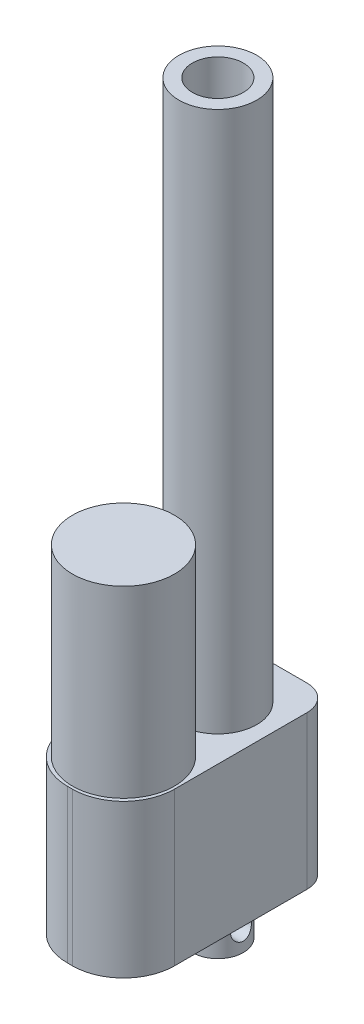
ISO-10303-21;
HEADER;
FILE_DESCRIPTION(('STEP AP214'),'2;1');
FILE_NAME('part.step','',(''),(''),'','','');
FILE_SCHEMA(('AUTOMOTIVE_DESIGN { 1 0 10303 214 1 1 1 1 }'));
ENDSEC;
DATA;
#1=APPLICATION_CONTEXT('core data for automotive mechanical design processes');
#2=APPLICATION_PROTOCOL_DEFINITION('international standard','automotive_design',2000,#1);
#3=PRODUCT_CONTEXT('',#1,'mechanical');
#4=PRODUCT('Part','Part','',(#3));
#5=PRODUCT_RELATED_PRODUCT_CATEGORY('part','',(#4));
#6=PRODUCT_DEFINITION_FORMATION('','',#4);
#7=PRODUCT_DEFINITION_CONTEXT('part definition',#1,'design');
#8=PRODUCT_DEFINITION('design','',#6,#7);
#9=PRODUCT_DEFINITION_SHAPE('','',#8);
#10=(LENGTH_UNIT() NAMED_UNIT(*) SI_UNIT(.MILLI.,.METRE.));
#11=(NAMED_UNIT(*) PLANE_ANGLE_UNIT() SI_UNIT($,.RADIAN.));
#12=(NAMED_UNIT(*) SI_UNIT($,.STERADIAN.) SOLID_ANGLE_UNIT());
#13=UNCERTAINTY_MEASURE_WITH_UNIT(LENGTH_MEASURE(1.E-05),#10,'distance_accuracy_value','');
#14=(GEOMETRIC_REPRESENTATION_CONTEXT(3) GLOBAL_UNCERTAINTY_ASSIGNED_CONTEXT((#13)) GLOBAL_UNIT_ASSIGNED_CONTEXT((#10,
#11,#12)) REPRESENTATION_CONTEXT('',''));
#15=CARTESIAN_POINT('',(0.,0.,0.));
#16=DIRECTION('',(0.,0.,1.));
#17=DIRECTION('',(1.,0.,0.));
#18=AXIS2_PLACEMENT_3D('',#15,#16,#17);
#19=CARTESIAN_POINT('',(-1.,-60.,38.));
#20=DIRECTION('',(0.,-1.,0.));
#21=DIRECTION('',(0.,0.,-1.));
#22=AXIS2_PLACEMENT_3D('',#19,#20,#21);
#23=PLANE('',#22);
#24=DIRECTION('',(1.,0.,0.));
#25=VECTOR('',#24,1.);
#26=CARTESIAN_POINT('',(-21.,-60.,-24.));
#27=LINE('',#26,#25);
#28=CARTESIAN_POINT('',(-11.,-60.,-24.));
#29=VERTEX_POINT('',#28);
#30=CARTESIAN_POINT('',(11.,-60.,-24.));
#31=VERTEX_POINT('',#30);
#32=EDGE_CURVE('E239',#29,#31,#27,.T.);
#33=ORIENTED_EDGE('',*,*,#32,.T.);
#34=CARTESIAN_POINT('',(11.,-60.,-14.));
#35=DIRECTION('',(0.,-1.,0.));
#36=DIRECTION('',(0.,0.,-1.));
#37=AXIS2_PLACEMENT_3D('',#34,#35,#36);
#38=CIRCLE('',#37,10.);
#39=CARTESIAN_POINT('',(21.,-60.,-14.));
#40=VERTEX_POINT('',#39);
#41=EDGE_CURVE('E39',#31,#40,#38,.T.);
#42=ORIENTED_EDGE('',*,*,#41,.T.);
#43=DIRECTION('',(0.,0.,1.));
#44=VECTOR('',#43,1.);
#45=CARTESIAN_POINT('',(21.,-60.,37.9999999999999));
#46=LINE('',#45,#44);
#47=CARTESIAN_POINT('',(21.,-60.,37.9999999999999));
#48=VERTEX_POINT('',#47);
#49=EDGE_CURVE('E97',#40,#48,#46,.T.);
#50=ORIENTED_EDGE('',*,*,#49,.T.);
#51=CARTESIAN_POINT('',(0.999999999999997,-60.,38.));
#52=DIRECTION('',(0.,-1.,0.));
#53=DIRECTION('',(0.,0.,-1.));
#54=AXIS2_PLACEMENT_3D('',#51,#52,#53);
#55=CIRCLE('',#54,20.);
#56=CARTESIAN_POINT('',(0.999999999999852,-60.,58.));
#57=VERTEX_POINT('',#56);
#58=EDGE_CURVE('E100',#48,#57,#55,.T.);
#59=ORIENTED_EDGE('',*,*,#58,.T.);
#60=DIRECTION('',(-1.,0.,0.));
#61=VECTOR('',#60,1.);
#62=CARTESIAN_POINT('',(-0.999999999999862,-60.,58.));
#63=LINE('',#62,#61);
#64=CARTESIAN_POINT('',(-0.99999999999986,-60.,58.));
#65=VERTEX_POINT('',#64);
#66=EDGE_CURVE('E116',#57,#65,#63,.T.);
#67=ORIENTED_EDGE('',*,*,#66,.T.);
#68=CARTESIAN_POINT('',(-1.,-60.,38.));
#69=DIRECTION('',(0.,-1.,0.));
#70=DIRECTION('',(0.,0.,-1.));
#71=AXIS2_PLACEMENT_3D('',#68,#69,#70);
#72=CIRCLE('',#71,20.);
#73=CARTESIAN_POINT('',(-21.,-60.,37.9999999999999));
#74=VERTEX_POINT('',#73);
#75=EDGE_CURVE('E255',#65,#74,#72,.T.);
#76=ORIENTED_EDGE('',*,*,#75,.T.);
#77=DIRECTION('',(0.,0.,-1.));
#78=VECTOR('',#77,1.);
#79=CARTESIAN_POINT('',(-21.,-60.,37.9999999999999));
#80=LINE('',#79,#78);
#81=CARTESIAN_POINT('',(-21.,-60.,-14.));
#82=VERTEX_POINT('',#81);
#83=EDGE_CURVE('E259',#74,#82,#80,.T.);
#84=ORIENTED_EDGE('',*,*,#83,.T.);
#85=CARTESIAN_POINT('',(-11.,-60.,-14.));
#86=DIRECTION('',(0.,-1.,0.));
#87=DIRECTION('',(0.,0.,-1.));
#88=AXIS2_PLACEMENT_3D('',#85,#86,#87);
#89=CIRCLE('',#88,10.);
#90=EDGE_CURVE('E216',#82,#29,#89,.T.);
#91=ORIENTED_EDGE('',*,*,#90,.T.);
#92=EDGE_LOOP('',(#33,#42,#50,#59,#67,#76,#84,#91));
#93=FACE_BOUND('',#92,.T.);
#94=CARTESIAN_POINT('',(0.,-60.,0.));
#95=DIRECTION('',(0.,-1.,0.));
#96=DIRECTION('',(0.,0.,-1.));
#97=AXIS2_PLACEMENT_3D('',#94,#95,#96);
#98=CIRCLE('',#97,10.);
#99=CARTESIAN_POINT('',(0.,-60.,-10.));
#100=VERTEX_POINT('',#99);
#101=EDGE_CURVE('E263',#100,#100,#98,.T.);
#102=ORIENTED_EDGE('',*,*,#101,.F.);
#103=EDGE_LOOP('',(#102));
#104=FACE_BOUND('',#103,.T.);
#105=ADVANCED_FACE('F31',(#93,#104),#23,.T.);
#106=CARTESIAN_POINT('',(-1.,0.,38.));
#107=DIRECTION('',(0.,-1.,0.));
#108=DIRECTION('',(0.,0.,-1.));
#109=AXIS2_PLACEMENT_3D('',#106,#107,#108);
#110=PLANE('',#109);
#111=CARTESIAN_POINT('',(0.,0.,0.));
#112=DIRECTION('',(0.,-1.,0.));
#113=DIRECTION('',(0.,0.,-1.));
#114=AXIS2_PLACEMENT_3D('',#111,#112,#113);
#115=CIRCLE('',#114,15.25);
#116=CARTESIAN_POINT('',(0.,0.,-15.25));
#117=VERTEX_POINT('',#116);
#118=EDGE_CURVE('E122',#117,#117,#115,.T.);
#119=ORIENTED_EDGE('',*,*,#118,.T.);
#120=EDGE_LOOP('',(#119));
#121=FACE_BOUND('',#120,.T.);
#122=DIRECTION('',(0.,0.,1.));
#123=VECTOR('',#122,1.);
#124=CARTESIAN_POINT('',(21.,0.,37.9999999999999));
#125=LINE('',#124,#123);
#126=CARTESIAN_POINT('',(21.,0.,-14.));
#127=VERTEX_POINT('',#126);
#128=CARTESIAN_POINT('',(21.,0.,37.9999999999999));
#129=VERTEX_POINT('',#128);
#130=EDGE_CURVE('E120',#127,#129,#125,.T.);
#131=ORIENTED_EDGE('',*,*,#130,.F.);
#132=CARTESIAN_POINT('',(11.,0.,-14.));
#133=DIRECTION('',(0.,-1.,0.));
#134=DIRECTION('',(0.,0.,-1.));
#135=AXIS2_PLACEMENT_3D('',#132,#133,#134);
#136=CIRCLE('',#135,10.);
#137=CARTESIAN_POINT('',(11.,0.,-24.));
#138=VERTEX_POINT('',#137);
#139=EDGE_CURVE('E223',#127,#138,#136,.F.);
#140=ORIENTED_EDGE('',*,*,#139,.T.);
#141=DIRECTION('',(1.,0.,0.));
#142=VECTOR('',#141,1.);
#143=CARTESIAN_POINT('',(-21.,0.,-24.));
#144=LINE('',#143,#142);
#145=CARTESIAN_POINT('',(-11.,0.,-24.));
#146=VERTEX_POINT('',#145);
#147=EDGE_CURVE('E107',#146,#138,#144,.T.);
#148=ORIENTED_EDGE('',*,*,#147,.F.);
#149=CARTESIAN_POINT('',(-11.,0.,-14.));
#150=DIRECTION('',(0.,-1.,0.));
#151=DIRECTION('',(0.,0.,-1.));
#152=AXIS2_PLACEMENT_3D('',#149,#150,#151);
#153=CIRCLE('',#152,10.);
#154=CARTESIAN_POINT('',(-21.,0.,-14.));
#155=VERTEX_POINT('',#154);
#156=EDGE_CURVE('E225',#146,#155,#153,.F.);
#157=ORIENTED_EDGE('',*,*,#156,.T.);
#158=DIRECTION('',(0.,0.,-1.));
#159=VECTOR('',#158,1.);
#160=CARTESIAN_POINT('',(-21.,0.,37.9999999999999));
#161=LINE('',#160,#159);
#162=CARTESIAN_POINT('',(-21.,0.,37.9999999999999));
#163=VERTEX_POINT('',#162);
#164=EDGE_CURVE('E245',#163,#155,#161,.T.);
#165=ORIENTED_EDGE('',*,*,#164,.F.);
#166=CARTESIAN_POINT('',(-1.,0.,38.));
#167=DIRECTION('',(0.,-1.,0.));
#168=DIRECTION('',(0.,0.,-1.));
#169=AXIS2_PLACEMENT_3D('',#166,#167,#168);
#170=CIRCLE('',#169,20.);
#171=CARTESIAN_POINT('',(-0.99999999999986,0.,58.));
#172=VERTEX_POINT('',#171);
#173=EDGE_CURVE('E243',#172,#163,#170,.T.);
#174=ORIENTED_EDGE('',*,*,#173,.F.);
#175=DIRECTION('',(-1.,0.,0.));
#176=VECTOR('',#175,1.);
#177=CARTESIAN_POINT('',(-0.999999999999862,0.,58.));
#178=LINE('',#177,#176);
#179=CARTESIAN_POINT('',(0.999999999999852,0.,58.));
#180=VERTEX_POINT('',#179);
#181=EDGE_CURVE('E233',#180,#172,#178,.T.);
#182=ORIENTED_EDGE('',*,*,#181,.F.);
#183=CARTESIAN_POINT('',(0.999999999999997,0.,38.));
#184=DIRECTION('',(0.,-1.,0.));
#185=DIRECTION('',(0.,0.,-1.));
#186=AXIS2_PLACEMENT_3D('',#183,#184,#185);
#187=CIRCLE('',#186,20.);
#188=EDGE_CURVE('E230',#129,#180,#187,.T.);
#189=ORIENTED_EDGE('',*,*,#188,.F.);
#190=EDGE_LOOP('',(#131,#140,#148,#157,#165,#174,#182,#189));
#191=FACE_BOUND('',#190,.T.);
#192=CARTESIAN_POINT('',(0.,0.,37.));
#193=DIRECTION('',(0.,-1.,0.));
#194=DIRECTION('',(0.,0.,-1.));
#195=AXIS2_PLACEMENT_3D('',#192,#193,#194);
#196=CIRCLE('',#195,20.);
#197=CARTESIAN_POINT('',(0.,0.,17.));
#198=VERTEX_POINT('',#197);
#199=EDGE_CURVE('E133',#198,#198,#196,.F.);
#200=ORIENTED_EDGE('',*,*,#199,.F.);
#201=EDGE_LOOP('',(#200));
#202=FACE_BOUND('',#201,.T.);
#203=ADVANCED_FACE('F171',(#121,#191,#202),#110,.F.);
#204=CARTESIAN_POINT('',(0.,212.,0.));
#205=DIRECTION('',(0.,-1.,0.));
#206=DIRECTION('',(0.,0.,-1.));
#207=AXIS2_PLACEMENT_3D('',#204,#205,#206);
#208=CYLINDRICAL_SURFACE('',#207,15.25);
#209=CARTESIAN_POINT('',(0.,212.,0.));
#210=DIRECTION('',(0.,1.,0.));
#211=DIRECTION('',(0.,0.,1.));
#212=AXIS2_PLACEMENT_3D('',#209,#210,#211);
#213=CIRCLE('',#212,15.25);
#214=CARTESIAN_POINT('',(0.,212.,15.25));
#215=VERTEX_POINT('',#214);
#216=EDGE_CURVE('E125',#215,#215,#213,.T.);
#217=ORIENTED_EDGE('',*,*,#216,.F.);
#218=EDGE_LOOP('',(#217));
#219=FACE_BOUND('',#218,.T.);
#220=ORIENTED_EDGE('',*,*,#118,.F.);
#221=EDGE_LOOP('',(#220));
#222=FACE_BOUND('',#221,.T.);
#223=ADVANCED_FACE('F176',(#219,#222),#208,.T.);
#224=CARTESIAN_POINT('',(0.,212.,0.));
#225=DIRECTION('',(0.,1.,0.));
#226=DIRECTION('',(0.,0.,1.));
#227=AXIS2_PLACEMENT_3D('',#224,#225,#226);
#228=PLANE('',#227);
#229=CARTESIAN_POINT('',(0.,212.,0.));
#230=DIRECTION('',(0.,1.,0.));
#231=DIRECTION('',(0.,0.,1.));
#232=AXIS2_PLACEMENT_3D('',#229,#230,#231);
#233=CIRCLE('',#232,10.);
#234=CARTESIAN_POINT('',(0.,212.,10.));
#235=VERTEX_POINT('',#234);
#236=EDGE_CURVE('E267',#235,#235,#233,.T.);
#237=ORIENTED_EDGE('',*,*,#236,.F.);
#238=EDGE_LOOP('',(#237));
#239=FACE_BOUND('',#238,.T.);
#240=ORIENTED_EDGE('',*,*,#216,.T.);
#241=EDGE_LOOP('',(#240));
#242=FACE_BOUND('',#241,.T.);
#243=ADVANCED_FACE('F200',(#239,#242),#228,.T.);
#244=CARTESIAN_POINT('',(21.,-60.,37.9999999999999));
#245=DIRECTION('',(-1.,0.,0.));
#246=DIRECTION('',(0.,0.,1.));
#247=AXIS2_PLACEMENT_3D('',#244,#245,#246);
#248=PLANE('',#247);
#249=ORIENTED_EDGE('',*,*,#49,.F.);
#250=DIRECTION('',(0.,1.,0.));
#251=VECTOR('',#250,1.);
#252=CARTESIAN_POINT('',(21.,-60.,-14.));
#253=LINE('',#252,#251);
#254=EDGE_CURVE('E136',#40,#127,#253,.T.);
#255=ORIENTED_EDGE('',*,*,#254,.T.);
#256=ORIENTED_EDGE('',*,*,#130,.T.);
#257=DIRECTION('',(0.,1.,0.));
#258=VECTOR('',#257,1.);
#259=CARTESIAN_POINT('',(21.,-60.,37.9999999999999));
#260=LINE('',#259,#258);
#261=EDGE_CURVE('E112',#48,#129,#260,.T.);
#262=ORIENTED_EDGE('',*,*,#261,.F.);
#263=EDGE_LOOP('',(#249,#255,#256,#262));
#264=FACE_BOUND('',#263,.T.);
#265=ADVANCED_FACE('F118',(#264),#248,.F.);
#266=CARTESIAN_POINT('',(0.999999999999997,-60.,38.));
#267=DIRECTION('',(0.,1.,0.));
#268=DIRECTION('',(0.,0.,1.));
#269=AXIS2_PLACEMENT_3D('',#266,#267,#268);
#270=CYLINDRICAL_SURFACE('',#269,20.);
#271=ORIENTED_EDGE('',*,*,#188,.T.);
#272=DIRECTION('',(0.,1.,0.));
#273=VECTOR('',#272,1.);
#274=CARTESIAN_POINT('',(0.999999999999852,-60.,58.));
#275=LINE('',#274,#273);
#276=EDGE_CURVE('E114',#57,#180,#275,.T.);
#277=ORIENTED_EDGE('',*,*,#276,.F.);
#278=ORIENTED_EDGE('',*,*,#58,.F.);
#279=ORIENTED_EDGE('',*,*,#261,.T.);
#280=EDGE_LOOP('',(#271,#277,#278,#279));
#281=FACE_BOUND('',#280,.T.);
#282=ADVANCED_FACE('F111',(#281),#270,.T.);
#283=CARTESIAN_POINT('',(-0.999999999999862,-60.,58.));
#284=DIRECTION('',(0.,0.,-1.));
#285=DIRECTION('',(-1.,0.,0.));
#286=AXIS2_PLACEMENT_3D('',#283,#284,#285);
#287=PLANE('',#286);
#288=ORIENTED_EDGE('',*,*,#181,.T.);
#289=DIRECTION('',(0.,1.,0.));
#290=VECTOR('',#289,1.);
#291=CARTESIAN_POINT('',(-0.99999999999986,-60.,58.));
#292=LINE('',#291,#290);
#293=EDGE_CURVE('E127',#65,#172,#292,.T.);
#294=ORIENTED_EDGE('',*,*,#293,.F.);
#295=ORIENTED_EDGE('',*,*,#66,.F.);
#296=ORIENTED_EDGE('',*,*,#276,.T.);
#297=EDGE_LOOP('',(#288,#294,#295,#296));
#298=FACE_BOUND('',#297,.T.);
#299=ADVANCED_FACE('F191',(#298),#287,.F.);
#300=CARTESIAN_POINT('',(-1.,-60.,38.));
#301=DIRECTION('',(0.,1.,0.));
#302=DIRECTION('',(0.,0.,1.));
#303=AXIS2_PLACEMENT_3D('',#300,#301,#302);
#304=CYLINDRICAL_SURFACE('',#303,20.);
#305=ORIENTED_EDGE('',*,*,#173,.T.);
#306=DIRECTION('',(0.,1.,0.));
#307=VECTOR('',#306,1.);
#308=CARTESIAN_POINT('',(-21.,-60.,37.9999999999999));
#309=LINE('',#308,#307);
#310=EDGE_CURVE('E248',#74,#163,#309,.T.);
#311=ORIENTED_EDGE('',*,*,#310,.F.);
#312=ORIENTED_EDGE('',*,*,#75,.F.);
#313=ORIENTED_EDGE('',*,*,#293,.T.);
#314=EDGE_LOOP('',(#305,#311,#312,#313));
#315=FACE_BOUND('',#314,.T.);
#316=ADVANCED_FACE('F188',(#315),#304,.T.);
#317=CARTESIAN_POINT('',(-21.,-60.,37.9999999999999));
#318=DIRECTION('',(1.,0.,0.));
#319=DIRECTION('',(0.,0.,-1.));
#320=AXIS2_PLACEMENT_3D('',#317,#318,#319);
#321=PLANE('',#320);
#322=ORIENTED_EDGE('',*,*,#164,.T.);
#323=DIRECTION('',(0.,1.,0.));
#324=VECTOR('',#323,1.);
#325=CARTESIAN_POINT('',(-21.,-60.,-14.));
#326=LINE('',#325,#324);
#327=EDGE_CURVE('E11',#155,#82,#326,.F.);
#328=ORIENTED_EDGE('',*,*,#327,.T.);
#329=ORIENTED_EDGE('',*,*,#83,.F.);
#330=ORIENTED_EDGE('',*,*,#310,.T.);
#331=EDGE_LOOP('',(#322,#328,#329,#330));
#332=FACE_BOUND('',#331,.T.);
#333=ADVANCED_FACE('F185',(#332),#321,.F.);
#334=CARTESIAN_POINT('',(-21.,-60.,-24.));
#335=DIRECTION('',(0.,0.,1.));
#336=DIRECTION('',(1.,0.,0.));
#337=AXIS2_PLACEMENT_3D('',#334,#335,#336);
#338=PLANE('',#337);
#339=ORIENTED_EDGE('',*,*,#147,.T.);
#340=DIRECTION('',(0.,1.,0.));
#341=VECTOR('',#340,1.);
#342=CARTESIAN_POINT('',(11.,-60.,-24.));
#343=LINE('',#342,#341);
#344=EDGE_CURVE('E52',#138,#31,#343,.F.);
#345=ORIENTED_EDGE('',*,*,#344,.T.);
#346=ORIENTED_EDGE('',*,*,#32,.F.);
#347=DIRECTION('',(0.,1.,0.));
#348=VECTOR('',#347,1.);
#349=CARTESIAN_POINT('',(-11.,-60.,-24.));
#350=LINE('',#349,#348);
#351=EDGE_CURVE('E220',#29,#146,#350,.T.);
#352=ORIENTED_EDGE('',*,*,#351,.T.);
#353=EDGE_LOOP('',(#339,#345,#346,#352));
#354=FACE_BOUND('',#353,.T.);
#355=ADVANCED_FACE('F182',(#354),#338,.F.);
#356=CARTESIAN_POINT('',(0.,72.,37.));
#357=DIRECTION('',(0.,-1.,0.));
#358=DIRECTION('',(0.,0.,-1.));
#359=AXIS2_PLACEMENT_3D('',#356,#357,#358);
#360=CYLINDRICAL_SURFACE('',#359,20.);
#361=CARTESIAN_POINT('',(0.,72.,37.));
#362=DIRECTION('',(0.,1.,0.));
#363=DIRECTION('',(0.,0.,1.));
#364=AXIS2_PLACEMENT_3D('',#361,#362,#363);
#365=CIRCLE('',#364,20.);
#366=CARTESIAN_POINT('',(0.,72.,57.));
#367=VERTEX_POINT('',#366);
#368=EDGE_CURVE('E231',#367,#367,#365,.T.);
#369=ORIENTED_EDGE('',*,*,#368,.F.);
#370=EDGE_LOOP('',(#369));
#371=FACE_BOUND('',#370,.T.);
#372=ORIENTED_EDGE('',*,*,#199,.T.);
#373=EDGE_LOOP('',(#372));
#374=FACE_BOUND('',#373,.T.);
#375=ADVANCED_FACE('F180',(#371,#374),#360,.T.);
#376=CARTESIAN_POINT('',(0.,72.,37.));
#377=DIRECTION('',(0.,1.,0.));
#378=DIRECTION('',(0.,0.,1.));
#379=AXIS2_PLACEMENT_3D('',#376,#377,#378);
#380=PLANE('',#379);
#381=ORIENTED_EDGE('',*,*,#368,.T.);
#382=EDGE_LOOP('',(#381));
#383=FACE_BOUND('',#382,.T.);
#384=ADVANCED_FACE('F167',(#383),#380,.T.);
#385=CARTESIAN_POINT('',(0.,-80.,0.));
#386=DIRECTION('',(0.,1.,0.));
#387=DIRECTION('',(0.,0.,1.));
#388=AXIS2_PLACEMENT_3D('',#385,#386,#387);
#389=CYLINDRICAL_SURFACE('',#388,10.);
#390=CARTESIAN_POINT('',(-9.12085522305886,-72.,-4.1));
#391=CARTESIAN_POINT('',(-9.12085596533272,-71.8904311101594,-4.09999925967746));
#392=CARTESIAN_POINT('',(-9.12283654243618,-71.7808209192231,-4.09560116971501));
#393=CARTESIAN_POINT('',(-9.13069362544329,-71.5623963121699,-4.07805385179874));
#394=CARTESIAN_POINT('',(-9.13657272649079,-71.4535824749798,-4.06489879454186));
#395=CARTESIAN_POINT('',(-9.15204689017393,-71.237369206976,-4.029938604936));
#396=CARTESIAN_POINT('',(-9.16164997665284,-71.1299733516283,-4.00811479206561));
#397=CARTESIAN_POINT('',(-9.18424889291285,-70.9175908992762,-3.95605463502448));
#398=CARTESIAN_POINT('',(-9.19724614740618,-70.8126053341789,-3.92581475783422));
#399=CARTESIAN_POINT('',(-9.24060853824777,-70.5032519891535,-3.8231810249799));
#400=CARTESIAN_POINT('',(-9.27543059699092,-70.3033749410437,-3.73869002053811));
#401=CARTESIAN_POINT('',(-9.35295862592864,-69.9207960243605,-3.54026011319138));
#402=CARTESIAN_POINT('',(-9.39566255568865,-69.7380897291078,-3.42632882864905));
#403=CARTESIAN_POINT('',(-9.48702803293929,-69.3837870459564,-3.16488096791837));
#404=CARTESIAN_POINT('',(-9.53588754300038,-69.2133415492731,-3.01587054527706));
#405=CARTESIAN_POINT('',(-9.63242754222868,-68.8990185801675,-2.69164176551106));
#406=CARTESIAN_POINT('',(-9.68010757925972,-68.7551511635057,-2.51641353413031));
#407=CARTESIAN_POINT('',(-9.77130889462596,-68.4922470976246,-2.13573178822405));
#408=CARTESIAN_POINT('',(-9.81457332953515,-68.3744983824589,-1.92932159893456));
#409=CARTESIAN_POINT('',(-9.88965682295362,-68.1758918386429,-1.49753033777828));
#410=CARTESIAN_POINT('',(-9.92148080826129,-68.0950181258374,-1.27215748385716));
#411=CARTESIAN_POINT('',(-9.96869581239697,-67.9766066407207,-0.820929418937579));
#412=CARTESIAN_POINT('',(-9.98483657956137,-67.9370838776738,-0.595675159327681));
#413=CARTESIAN_POINT('',(-10.0015844714773,-67.89609137782,-0.14119228472589));
#414=CARTESIAN_POINT('',(-10.0021976864681,-67.8946067216484,0.0880347367606906));
#415=CARTESIAN_POINT('',(-9.9882687994468,-67.9286729210307,0.529557208852952));
#416=CARTESIAN_POINT('',(-9.97461815282765,-67.9620452515331,0.742054067374088));
#417=CARTESIAN_POINT('',(-9.93491042951043,-68.0611553673972,1.15812267080467));
#418=CARTESIAN_POINT('',(-9.90885243989074,-68.1268955343686,1.36169375775963));
#419=CARTESIAN_POINT('',(-9.84636198746041,-68.289668715149,1.75784359059216));
#420=CARTESIAN_POINT('',(-9.80977786154984,-68.3871621657746,1.95020823498028));
#421=CARTESIAN_POINT('',(-9.72983561083603,-68.6102315595739,2.31634838467447));
#422=CARTESIAN_POINT('',(-9.6864751202974,-68.7358173168429,2.4901173621113));
#423=CARTESIAN_POINT('',(-9.59384306988983,-69.021527198417,2.82678641524571));
#424=CARTESIAN_POINT('',(-9.54437006161635,-69.1834287918436,2.98812486066515));
#425=CARTESIAN_POINT('',(-9.44734557070162,-69.5321353234276,3.28202166038336));
#426=CARTESIAN_POINT('',(-9.39979478809316,-69.7189492295125,3.41456960530335));
#427=CARTESIAN_POINT('',(-9.31058773641422,-70.1195072364479,3.65095256972927));
#428=CARTESIAN_POINT('',(-9.2691595423218,-70.3339060351124,3.75377157702678));
#429=CARTESIAN_POINT('',(-9.19958663346997,-70.7791257339871,3.92121471303796));
#430=CARTESIAN_POINT('',(-9.17143277532646,-71.0099352040227,3.98586514009408));
#431=CARTESIAN_POINT('',(-9.13384389631223,-71.4658019823196,4.07123438627854));
#432=CARTESIAN_POINT('',(-9.12333548314578,-71.6902965601388,4.09447809388697));
#433=CARTESIAN_POINT('',(-9.11916269038392,-72.1401757037247,4.10376930250991));
#434=CARTESIAN_POINT('',(-9.12549278427906,-72.365559953251,4.08982900755603));
#435=CARTESIAN_POINT('',(-9.15317769851487,-72.7963183495239,4.02745008704151));
#436=CARTESIAN_POINT('',(-9.17359053249802,-73.0020735427073,3.98117213981194));
#437=CARTESIAN_POINT('',(-9.22595136152163,-73.4027428505744,3.85827032285215));
#438=CARTESIAN_POINT('',(-9.25790199625285,-73.5976544726113,3.78163950841278));
#439=CARTESIAN_POINT('',(-9.33136282255576,-73.9801702746578,3.59665612210532));
#440=CARTESIAN_POINT('',(-9.37321580705946,-74.1671317675103,3.48711504128026));
#441=CARTESIAN_POINT('',(-9.46126413100215,-74.5208992249382,3.24061603577818));
#442=CARTESIAN_POINT('',(-9.50746130179005,-74.6876966207381,3.10364652055162));
#443=CARTESIAN_POINT('',(-9.60336102034687,-75.0099931248203,2.7935233486464));
#444=CARTESIAN_POINT('',(-9.65305467319874,-75.1635835948118,2.61837568113369));
#445=CARTESIAN_POINT('',(-9.74696958396229,-75.4395172814611,2.24362584262218));
#446=CARTESIAN_POINT('',(-9.79119051525483,-75.561858633594,2.04402221347316));
#447=CARTESIAN_POINT('',(-9.8694021992832,-75.7715516218263,1.62491414975622));
#448=CARTESIAN_POINT('',(-9.90337882012906,-75.8588549779099,1.40538276300097));
#449=CARTESIAN_POINT('',(-9.95708468115726,-75.9946799215028,0.953004327918231));
#450=CARTESIAN_POINT('',(-9.97682210086024,-76.0432237756086,0.720165007256111));
#451=CARTESIAN_POINT('',(-9.99891204432231,-76.0974126149518,0.264871065575684));
#452=CARTESIAN_POINT('',(-10.0023560365527,-76.1057516425702,0.042787747061715));
#453=CARTESIAN_POINT('',(-9.99446223101127,-76.0864849765232,-0.39952179902721));
#454=CARTESIAN_POINT('',(-9.9831268816634,-76.0588852366651,-0.619748328125073));
#455=CARTESIAN_POINT('',(-9.94751099059553,-75.9704565860899,-1.04449984233166));
#456=CARTESIAN_POINT('',(-9.92367712380005,-75.9107725683895,-1.24930369986062));
#457=CARTESIAN_POINT('',(-9.86565366173738,-75.7610989719221,-1.64593153731293));
#458=CARTESIAN_POINT('',(-9.83146206802113,-75.671103544411,-1.83775300363132));
#459=CARTESIAN_POINT('',(-9.75414549697255,-75.4588362658745,-2.21243818518471));
#460=CARTESIAN_POINT('',(-9.71068860264697,-75.3352977134736,-2.3945141498123));
#461=CARTESIAN_POINT('',(-9.62002751017241,-75.0613096224511,-2.73612076285873));
#462=CARTESIAN_POINT('',(-9.57282198005288,-74.9108504943616,-2.89564334109287));
#463=CARTESIAN_POINT('',(-9.47611720874012,-74.5756956637151,-3.19845373653412));
#464=CARTESIAN_POINT('',(-9.4266702576376,-74.3894029554774,-3.33999374085981));
#465=CARTESIAN_POINT('',(-9.3343056253387,-73.9939993614421,-3.59007004090854));
#466=CARTESIAN_POINT('',(-9.29139153729628,-73.7848760263176,-3.69858820675982));
#467=CARTESIAN_POINT('',(-9.23622129819828,-73.4591829591169,-3.8333442677463));
#468=CARTESIAN_POINT('',(-9.21940140447578,-73.3489646051561,-3.87351403521268));
#469=CARTESIAN_POINT('',(-9.18931452171964,-73.1250649175959,-3.9443615039296));
#470=CARTESIAN_POINT('',(-9.1760458010338,-73.0113853020365,-3.97504383266126));
#471=CARTESIAN_POINT('',(-9.15358332531828,-72.7817415629849,-4.0264995244157));
#472=CARTESIAN_POINT('',(-9.14437880062055,-72.66578433806,-4.04729908695137));
#473=CARTESIAN_POINT('',(-9.1303524758709,-72.4323063927629,-4.07884371100538));
#474=CARTESIAN_POINT('',(-9.12552723865381,-72.3147869721487,-4.08959665799227));
#475=CARTESIAN_POINT('',(-9.1222741735823,-72.164216339518,-4.09684198073778));
#476=CARTESIAN_POINT('',(-9.12174238638647,-72.1313877221535,-4.09802592436254));
#477=CARTESIAN_POINT('',(-9.1210327987552,-72.0657073078433,-4.0996050473969));
#478=CARTESIAN_POINT('',(-9.12085500047937,-72.0328555107575,-4.10000022199436));
#479=CARTESIAN_POINT('',(-9.12085522305886,-72.,-4.1));
#480=B_SPLINE_CURVE_WITH_KNOTS('',3,(#390,#391,#392,#393,#394,#395,#396,#397,#398,#399,#400,
#401,#402,#403,#404,#405,#406,#407,#408,#409,#410,#411,#412,#413,#414,#415,#416,#417,#418,#419,
#420,#421,#422,#423,#424,#425,#426,#427,#428,#429,#430,#431,#432,#433,#434,#435,#436,#437,#438,
#439,#440,#441,#442,#443,#444,#445,#446,#447,#448,#449,#450,#451,#452,#453,#454,#455,#456,#457,
#458,#459,#460,#461,#462,#463,#464,#465,#466,#467,#468,#469,#470,#471,#472,#473,#474,#475,#476,
#477,#478,#479),.UNSPECIFIED.,.T.,.F.,(4,2,2,2,2,2,2,2,2,2,2,2,2,2,2,2,2,2,2,2,2,2,2,2,2,2,2,2,
2,2,2,2,2,2,2,2,2,2,2,2,2,2,2,2,4),(0.,0.328672117912807,0.657563244052506,0.987166984768422,
1.31690930065161,1.97304413884267,2.62900935650068,3.32078211378878,4.01281606819734,
4.73375144831508,5.45437598660242,6.13855213459813,6.82245992986428,7.46604317889662,
8.10967378955022,8.763087017599,9.4167288741776,10.115178046345,10.813879328211,
11.5342125904293,12.2540489584539,12.928257957815,13.6022457046249,14.2350381243769,
14.8679754101843,15.5272803032894,16.1868643918112,16.8981179872649,17.6094140108089,
18.3216868150722,19.0335501371541,19.6969795678326,20.3602991052417,21.0013834077002,
21.6425914816395,22.3125612243291,22.9827700960302,23.6968784482773,24.4113781606393,
24.7665102641623,25.1214688784181,25.4754811625661,25.8292153527014,25.9277709230013,
26.0263270945705),.UNSPECIFIED.);
#481=CARTESIAN_POINT('',(-9.12085522305886,-72.,-4.1));
#482=VERTEX_POINT('',#481);
#483=EDGE_CURVE('E144',#482,#482,#480,.T.);
#484=ORIENTED_EDGE('',*,*,#483,.T.);
#485=EDGE_LOOP('',(#484));
#486=FACE_BOUND('',#485,.T.);
#487=CARTESIAN_POINT('',(9.12085522305886,-72.,-4.1));
#488=CARTESIAN_POINT('',(9.12085596533272,-72.1095688898405,-4.09999925967746));
#489=CARTESIAN_POINT('',(9.12283654243618,-72.2191790807769,-4.09560116971501));
#490=CARTESIAN_POINT('',(9.1306936254433,-72.4376036878301,-4.07805385179874));
#491=CARTESIAN_POINT('',(9.13657272649079,-72.5464175250202,-4.06489879454186));
#492=CARTESIAN_POINT('',(9.15204689017392,-72.762630793024,-4.029938604936));
#493=CARTESIAN_POINT('',(9.16164997665284,-72.8700266483717,-4.00811479206561));
#494=CARTESIAN_POINT('',(9.18424889291285,-73.0824091007237,-3.95605463502449));
#495=CARTESIAN_POINT('',(9.19724614740618,-73.1873946658211,-3.92581475783422));
#496=CARTESIAN_POINT('',(9.24060853824777,-73.4967480108465,-3.8231810249799));
#497=CARTESIAN_POINT('',(9.27543059699093,-73.6966250589563,-3.73869002053811));
#498=CARTESIAN_POINT('',(9.35295862592864,-74.0792039756395,-3.54026011319138));
#499=CARTESIAN_POINT('',(9.39566255568865,-74.2619102708922,-3.42632882864905));
#500=CARTESIAN_POINT('',(9.48702803293929,-74.6162129540435,-3.16488096791837));
#501=CARTESIAN_POINT('',(9.53588754300038,-74.7866584507269,-3.01587054527706));
#502=CARTESIAN_POINT('',(9.63242754222868,-75.1009814198325,-2.69164176551106));
#503=CARTESIAN_POINT('',(9.68010757925972,-75.2448488364943,-2.51641353413031));
#504=CARTESIAN_POINT('',(9.77130889462596,-75.5077529023754,-2.13573178822405));
#505=CARTESIAN_POINT('',(9.81457332953515,-75.6255016175411,-1.92932159893457));
#506=CARTESIAN_POINT('',(9.88965682295362,-75.8241081613571,-1.49753033777829));
#507=CARTESIAN_POINT('',(9.92148080826129,-75.9049818741626,-1.27215748385716));
#508=CARTESIAN_POINT('',(9.96869581239697,-76.0233933592793,-0.820929418937579));
#509=CARTESIAN_POINT('',(9.98483657956137,-76.0629161223262,-0.595675159327682));
#510=CARTESIAN_POINT('',(10.0015844714773,-76.10390862218,-0.14119228472589));
#511=CARTESIAN_POINT('',(10.0021976864681,-76.1053932783516,0.0880347367606907));
#512=CARTESIAN_POINT('',(9.9882687994468,-76.0713270789693,0.529557208852952));
#513=CARTESIAN_POINT('',(9.97461815282765,-76.0379547484669,0.742054067374088));
#514=CARTESIAN_POINT('',(9.93491042951043,-75.9388446326028,1.15812267080467));
#515=CARTESIAN_POINT('',(9.90885243989074,-75.8731044656314,1.36169375775963));
#516=CARTESIAN_POINT('',(9.84636198746041,-75.710331284851,1.75784359059216));
#517=CARTESIAN_POINT('',(9.80977786154984,-75.6128378342253,1.95020823498028));
#518=CARTESIAN_POINT('',(9.72983561083603,-75.3897684404261,2.31634838467447));
#519=CARTESIAN_POINT('',(9.6864751202974,-75.264182683157,2.4901173621113));
#520=CARTESIAN_POINT('',(9.59384306988983,-74.978472801583,2.82678641524571));
#521=CARTESIAN_POINT('',(9.54437006161635,-74.8165712081563,2.98812486066515));
#522=CARTESIAN_POINT('',(9.44734557070162,-74.4678646765724,3.28202166038336));
#523=CARTESIAN_POINT('',(9.39979478809316,-74.2810507704875,3.41456960530335));
#524=CARTESIAN_POINT('',(9.31058773641422,-73.8804927635521,3.65095256972926));
#525=CARTESIAN_POINT('',(9.26915954232181,-73.6660939648876,3.75377157702677));
#526=CARTESIAN_POINT('',(9.19958663346997,-73.2208742660129,3.92121471303795));
#527=CARTESIAN_POINT('',(9.17143277532647,-72.9900647959773,3.98586514009408));
#528=CARTESIAN_POINT('',(9.13384389631223,-72.5341980176804,4.07123438627854));
#529=CARTESIAN_POINT('',(9.12333548314578,-72.3097034398612,4.09447809388697));
#530=CARTESIAN_POINT('',(9.11916269038392,-71.8598242962753,4.10376930250991));
#531=CARTESIAN_POINT('',(9.12549278427906,-71.634440046749,4.08982900755603));
#532=CARTESIAN_POINT('',(9.15317769851487,-71.2036816504761,4.02745008704151));
#533=CARTESIAN_POINT('',(9.17359053249802,-70.9979264572927,3.98117213981194));
#534=CARTESIAN_POINT('',(9.22595136152163,-70.5972571494256,3.85827032285215));
#535=CARTESIAN_POINT('',(9.25790199625285,-70.4023455273886,3.78163950841278));
#536=CARTESIAN_POINT('',(9.33136282255576,-70.0198297253422,3.59665612210532));
#537=CARTESIAN_POINT('',(9.37321580705946,-69.8328682324897,3.48711504128026));
#538=CARTESIAN_POINT('',(9.46126413100215,-69.4791007750618,3.24061603577818));
#539=CARTESIAN_POINT('',(9.50746130179005,-69.3123033792619,3.10364652055162));
#540=CARTESIAN_POINT('',(9.60336102034687,-68.9900068751796,2.7935233486464));
#541=CARTESIAN_POINT('',(9.65305467319874,-68.8364164051882,2.61837568113369));
#542=CARTESIAN_POINT('',(9.74696958396229,-68.5604827185389,2.24362584262218));
#543=CARTESIAN_POINT('',(9.79119051525483,-68.438141366406,2.04402221347316));
#544=CARTESIAN_POINT('',(9.8694021992832,-68.2284483781737,1.62491414975622));
#545=CARTESIAN_POINT('',(9.90337882012906,-68.1411450220901,1.40538276300097));
#546=CARTESIAN_POINT('',(9.95708468115726,-68.0053200784972,0.953004327918231));
#547=CARTESIAN_POINT('',(9.97682210086024,-67.9567762243914,0.720165007256111));
#548=CARTESIAN_POINT('',(9.99891204432231,-67.9025873850482,0.264871065575684));
#549=CARTESIAN_POINT('',(10.0023560365527,-67.8942483574297,0.042787747061715));
#550=CARTESIAN_POINT('',(9.99446223101127,-67.9135150234768,-0.39952179902721));
#551=CARTESIAN_POINT('',(9.9831268816634,-67.9411147633348,-0.619748328125073));
#552=CARTESIAN_POINT('',(9.94751099059553,-68.0295434139101,-1.04449984233166));
#553=CARTESIAN_POINT('',(9.92367712380005,-68.0892274316104,-1.24930369986062));
#554=CARTESIAN_POINT('',(9.86565366173738,-68.2389010280779,-1.64593153731293));
#555=CARTESIAN_POINT('',(9.83146206802113,-68.328896455589,-1.83775300363132));
#556=CARTESIAN_POINT('',(9.75414549697255,-68.5411637341255,-2.21243818518471));
#557=CARTESIAN_POINT('',(9.71068860264697,-68.6647022865264,-2.3945141498123));
#558=CARTESIAN_POINT('',(9.62002751017241,-68.9386903775489,-2.73612076285873));
#559=CARTESIAN_POINT('',(9.57282198005288,-69.0891495056384,-2.89564334109287));
#560=CARTESIAN_POINT('',(9.47611720874012,-69.4243043362849,-3.19845373653412));
#561=CARTESIAN_POINT('',(9.4266702576376,-69.6105970445226,-3.33999374085981));
#562=CARTESIAN_POINT('',(9.3343056253387,-70.0060006385579,-3.59007004090854));
#563=CARTESIAN_POINT('',(9.29139153729628,-70.2151239736824,-3.69858820675982));
#564=CARTESIAN_POINT('',(9.23622129819828,-70.5408170408831,-3.8333442677463));
#565=CARTESIAN_POINT('',(9.21940140447578,-70.6510353948439,-3.87351403521268));
#566=CARTESIAN_POINT('',(9.18931452171964,-70.8749350824041,-3.9443615039296));
#567=CARTESIAN_POINT('',(9.1760458010338,-70.9886146979634,-3.97504383266126));
#568=CARTESIAN_POINT('',(9.15358332531827,-71.2182584370151,-4.0264995244157));
#569=CARTESIAN_POINT('',(9.14437880062055,-71.33421566194,-4.04729908695138));
#570=CARTESIAN_POINT('',(9.1303524758709,-71.5676936072371,-4.07884371100539));
#571=CARTESIAN_POINT('',(9.12552723865381,-71.6852130278513,-4.08959665799227));
#572=CARTESIAN_POINT('',(9.1222741735823,-71.8357836604819,-4.09684198073778));
#573=CARTESIAN_POINT('',(9.12174238638647,-71.8686122778465,-4.09802592436254));
#574=CARTESIAN_POINT('',(9.1210327987552,-71.9342926921567,-4.0996050473969));
#575=CARTESIAN_POINT('',(9.12085500047937,-71.9671444892425,-4.10000022199436));
#576=CARTESIAN_POINT('',(9.12085522305886,-72.,-4.1));
#577=B_SPLINE_CURVE_WITH_KNOTS('',3,(#487,#488,#489,#490,#491,#492,#493,#494,#495,#496,#497,
#498,#499,#500,#501,#502,#503,#504,#505,#506,#507,#508,#509,#510,#511,#512,#513,#514,#515,#516,
#517,#518,#519,#520,#521,#522,#523,#524,#525,#526,#527,#528,#529,#530,#531,#532,#533,#534,#535,
#536,#537,#538,#539,#540,#541,#542,#543,#544,#545,#546,#547,#548,#549,#550,#551,#552,#553,#554,
#555,#556,#557,#558,#559,#560,#561,#562,#563,#564,#565,#566,#567,#568,#569,#570,#571,#572,#573,
#574,#575,#576),.UNSPECIFIED.,.T.,.F.,(4,2,2,2,2,2,2,2,2,2,2,2,2,2,2,2,2,2,2,2,2,2,2,2,2,2,2,2,
2,2,2,2,2,2,2,2,2,2,2,2,2,2,2,2,4),(0.,0.328672117912821,0.657563244052506,0.987166984768422,
1.31690930065161,1.97304413884267,2.62900935650068,3.32078211378878,4.01281606819734,
4.73375144831506,5.45437598660242,6.13855213459813,6.82245992986428,7.46604317889662,
8.10967378955022,8.763087017599,9.4167288741776,10.115178046345,10.813879328211,
11.5342125904293,12.2540489584539,12.928257957815,13.6022457046249,14.2350381243769,
14.8679754101843,15.5272803032894,16.1868643918112,16.8981179872649,17.6094140108089,
18.3216868150722,19.0335501371541,19.6969795678326,20.3602991052417,21.0013834077002,
21.6425914816395,22.3125612243291,22.9827700960302,23.6968784482773,24.4113781606393,
24.7665102641623,25.1214688784181,25.4754811625661,25.8292153527014,25.9277709230013,
26.0263270945705),.UNSPECIFIED.);
#578=CARTESIAN_POINT('',(9.12085522305886,-72.,-4.1));
#579=VERTEX_POINT('',#578);
#580=EDGE_CURVE('E137',#579,#579,#577,.T.);
#581=ORIENTED_EDGE('',*,*,#580,.T.);
#582=EDGE_LOOP('',(#581));
#583=FACE_BOUND('',#582,.T.);
#584=CARTESIAN_POINT('',(0.,-80.,0.));
#585=DIRECTION('',(0.,-1.,0.));
#586=DIRECTION('',(0.,0.,-1.));
#587=AXIS2_PLACEMENT_3D('',#584,#585,#586);
#588=CIRCLE('',#587,10.);
#589=CARTESIAN_POINT('',(0.,-80.,-10.));
#590=VERTEX_POINT('',#589);
#591=EDGE_CURVE('E236',#590,#590,#588,.T.);
#592=ORIENTED_EDGE('',*,*,#591,.F.);
#593=EDGE_LOOP('',(#592));
#594=FACE_BOUND('',#593,.T.);
#595=ORIENTED_EDGE('',*,*,#101,.T.);
#596=EDGE_LOOP('',(#595));
#597=FACE_BOUND('',#596,.T.);
#598=ADVANCED_FACE('F149',(#486,#583,#594,#597),#389,.T.);
#599=CARTESIAN_POINT('',(0.,-80.,0.));
#600=DIRECTION('',(0.,-1.,0.));
#601=DIRECTION('',(0.,0.,-1.));
#602=AXIS2_PLACEMENT_3D('',#599,#600,#601);
#603=PLANE('',#602);
#604=ORIENTED_EDGE('',*,*,#591,.T.);
#605=EDGE_LOOP('',(#604));
#606=FACE_BOUND('',#605,.T.);
#607=ADVANCED_FACE('F158',(#606),#603,.T.);
#608=CARTESIAN_POINT('',(-15.,-72.,0.));
#609=DIRECTION('',(1.,0.,0.));
#610=DIRECTION('',(0.,0.,-1.));
#611=AXIS2_PLACEMENT_3D('',#608,#609,#610);
#612=CYLINDRICAL_SURFACE('',#611,4.1);
#613=ORIENTED_EDGE('',*,*,#580,.F.);
#614=EDGE_LOOP('',(#613));
#615=FACE_BOUND('',#614,.T.);
#616=ORIENTED_EDGE('',*,*,#483,.F.);
#617=EDGE_LOOP('',(#616));
#618=FACE_BOUND('',#617,.T.);
#619=ADVANCED_FACE('F153',(#615,#618),#612,.F.);
#620=CARTESIAN_POINT('',(0.,62.,0.));
#621=DIRECTION('',(0.,1.,0.));
#622=DIRECTION('',(0.,0.,1.));
#623=AXIS2_PLACEMENT_3D('',#620,#621,#622);
#624=CYLINDRICAL_SURFACE('',#623,10.);
#625=CARTESIAN_POINT('',(0.,62.,0.));
#626=DIRECTION('',(0.,1.,0.));
#627=DIRECTION('',(0.,0.,1.));
#628=AXIS2_PLACEMENT_3D('',#625,#626,#627);
#629=CIRCLE('',#628,10.);
#630=CARTESIAN_POINT('',(0.,62.,10.));
#631=VERTEX_POINT('',#630);
#632=EDGE_CURVE('E145',#631,#631,#629,.T.);
#633=ORIENTED_EDGE('',*,*,#632,.F.);
#634=EDGE_LOOP('',(#633));
#635=FACE_BOUND('',#634,.T.);
#636=ORIENTED_EDGE('',*,*,#236,.T.);
#637=EDGE_LOOP('',(#636));
#638=FACE_BOUND('',#637,.T.);
#639=ADVANCED_FACE('F157',(#635,#638),#624,.F.);
#640=CARTESIAN_POINT('',(0.,62.,0.));
#641=DIRECTION('',(0.,1.,0.));
#642=DIRECTION('',(0.,0.,1.));
#643=AXIS2_PLACEMENT_3D('',#640,#641,#642);
#644=PLANE('',#643);
#645=ORIENTED_EDGE('',*,*,#632,.T.);
#646=EDGE_LOOP('',(#645));
#647=FACE_BOUND('',#646,.T.);
#648=ADVANCED_FACE('F208',(#647),#644,.T.);
#649=CARTESIAN_POINT('',(11.,-60.,-14.));
#650=DIRECTION('',(0.,1.,0.));
#651=DIRECTION('',(0.,0.,1.));
#652=AXIS2_PLACEMENT_3D('',#649,#650,#651);
#653=CYLINDRICAL_SURFACE('',#652,10.);
#654=ORIENTED_EDGE('',*,*,#41,.F.);
#655=ORIENTED_EDGE('',*,*,#344,.F.);
#656=ORIENTED_EDGE('',*,*,#139,.F.);
#657=ORIENTED_EDGE('',*,*,#254,.F.);
#658=EDGE_LOOP('',(#654,#655,#656,#657));
#659=FACE_BOUND('',#658,.T.);
#660=ADVANCED_FACE('F206',(#659),#653,.T.);
#661=CARTESIAN_POINT('',(-11.,-60.,-14.));
#662=DIRECTION('',(0.,1.,0.));
#663=DIRECTION('',(0.,0.,1.));
#664=AXIS2_PLACEMENT_3D('',#661,#662,#663);
#665=CYLINDRICAL_SURFACE('',#664,10.);
#666=ORIENTED_EDGE('',*,*,#90,.F.);
#667=ORIENTED_EDGE('',*,*,#327,.F.);
#668=ORIENTED_EDGE('',*,*,#156,.F.);
#669=ORIENTED_EDGE('',*,*,#351,.F.);
#670=EDGE_LOOP('',(#666,#667,#668,#669));
#671=FACE_BOUND('',#670,.T.);
#672=ADVANCED_FACE('F33',(#671),#665,.T.);
#673=CLOSED_SHELL('',(#105,#203,#223,#243,#265,#282,#299,#316,#333,#355,#375,#384,#598,#607,
#619,#639,#648,#660,#672));
#674=MANIFOLD_SOLID_BREP('B2',#673);
#675=ADVANCED_BREP_SHAPE_REPRESENTATION('',(#18,#674),#14);
#676=SHAPE_DEFINITION_REPRESENTATION(#9,#675);
ENDSEC;
END-ISO-10303-21;
